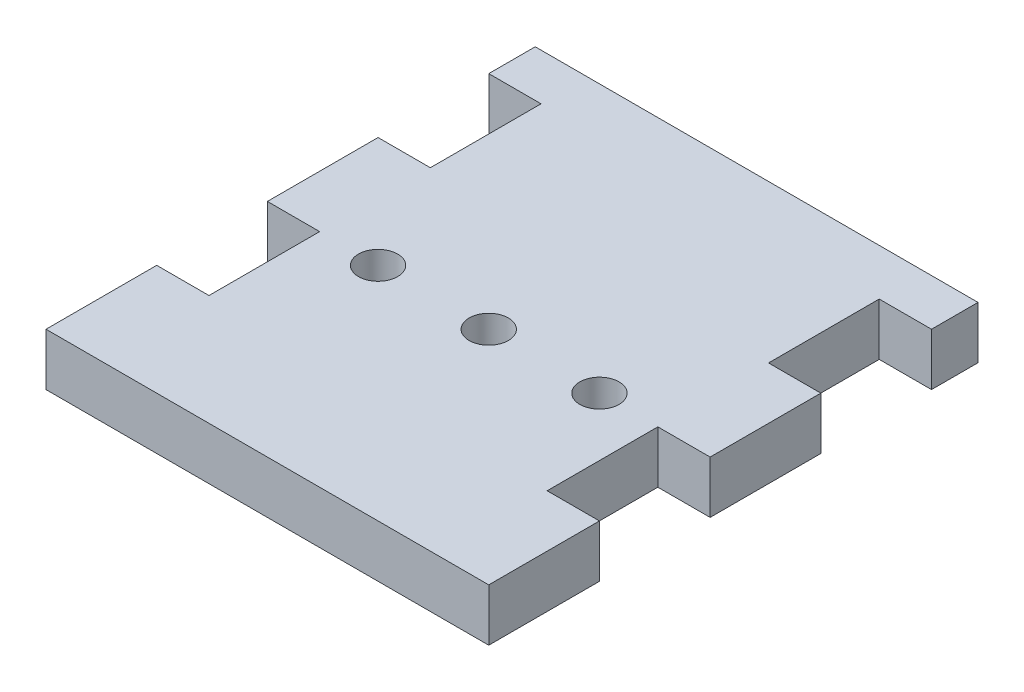
ISO-10303-21;
HEADER;
FILE_DESCRIPTION(('STEP AP214'),'2;1');
FILE_NAME('part.step','',(''),(''),'','','');
FILE_SCHEMA(('AUTOMOTIVE_DESIGN { 1 0 10303 214 1 1 1 1 }'));
ENDSEC;
DATA;
#1=APPLICATION_CONTEXT('core data for automotive mechanical design processes');
#2=APPLICATION_PROTOCOL_DEFINITION('international standard','automotive_design',2000,#1);
#3=PRODUCT_CONTEXT('',#1,'mechanical');
#4=PRODUCT('Part','Part','',(#3));
#5=PRODUCT_RELATED_PRODUCT_CATEGORY('part','',(#4));
#6=PRODUCT_DEFINITION_FORMATION('','',#4);
#7=PRODUCT_DEFINITION_CONTEXT('part definition',#1,'design');
#8=PRODUCT_DEFINITION('design','',#6,#7);
#9=PRODUCT_DEFINITION_SHAPE('','',#8);
#10=(LENGTH_UNIT() NAMED_UNIT(*) SI_UNIT(.MILLI.,.METRE.));
#11=(NAMED_UNIT(*) PLANE_ANGLE_UNIT() SI_UNIT($,.RADIAN.));
#12=(NAMED_UNIT(*) SI_UNIT($,.STERADIAN.) SOLID_ANGLE_UNIT());
#13=UNCERTAINTY_MEASURE_WITH_UNIT(LENGTH_MEASURE(1.E-05),#10,'distance_accuracy_value','');
#14=(GEOMETRIC_REPRESENTATION_CONTEXT(3) GLOBAL_UNCERTAINTY_ASSIGNED_CONTEXT((#13)) GLOBAL_UNIT_ASSIGNED_CONTEXT((#10,
#11,#12)) REPRESENTATION_CONTEXT('',''));
#15=CARTESIAN_POINT('',(0.,0.,0.));
#16=DIRECTION('',(0.,0.,1.));
#17=DIRECTION('',(1.,0.,0.));
#18=AXIS2_PLACEMENT_3D('',#15,#16,#17);
#19=CARTESIAN_POINT('',(25.4,6.,28.067));
#20=DIRECTION('',(-1.,0.,0.));
#21=DIRECTION('',(0.,0.,1.));
#22=AXIS2_PLACEMENT_3D('',#19,#20,#21);
#23=PLANE('',#22);
#24=DIRECTION('',(0.,0.,-1.));
#25=VECTOR('',#24,1.);
#26=CARTESIAN_POINT('',(25.4,0.,28.067));
#27=LINE('',#26,#25);
#28=CARTESIAN_POINT('',(25.4,0.,2.66700000000001));
#29=VERTEX_POINT('',#28);
#30=CARTESIAN_POINT('',(25.4,0.,-10.033));
#31=VERTEX_POINT('',#30);
#32=EDGE_CURVE('E185',#29,#31,#27,.T.);
#33=ORIENTED_EDGE('',*,*,#32,.T.);
#34=DIRECTION('',(0.,1.,0.));
#35=VECTOR('',#34,1.);
#36=CARTESIAN_POINT('',(25.4,0.,-10.033));
#37=LINE('',#36,#35);
#38=CARTESIAN_POINT('',(25.4,6.,-10.033));
#39=VERTEX_POINT('',#38);
#40=EDGE_CURVE('E169',#31,#39,#37,.T.);
#41=ORIENTED_EDGE('',*,*,#40,.T.);
#42=DIRECTION('',(0.,0.,-1.));
#43=VECTOR('',#42,1.);
#44=CARTESIAN_POINT('',(25.4,6.,28.067));
#45=LINE('',#44,#43);
#46=CARTESIAN_POINT('',(25.4,6.,2.66700000000001));
#47=VERTEX_POINT('',#46);
#48=EDGE_CURVE('E310',#47,#39,#45,.T.);
#49=ORIENTED_EDGE('',*,*,#48,.F.);
#50=DIRECTION('',(0.,1.,0.));
#51=VECTOR('',#50,1.);
#52=CARTESIAN_POINT('',(25.4,0.,2.66700000000001));
#53=LINE('',#52,#51);
#54=EDGE_CURVE('E191',#29,#47,#53,.T.);
#55=ORIENTED_EDGE('',*,*,#54,.F.);
#56=EDGE_LOOP('',(#33,#41,#49,#55));
#57=FACE_BOUND('',#56,.T.);
#58=ADVANCED_FACE('F32',(#57),#23,.F.);
#59=CARTESIAN_POINT('',(25.4,0.,28.067));
#60=VERTEX_POINT('',#59);
#61=CARTESIAN_POINT('',(25.4,0.,15.367));
#62=VERTEX_POINT('',#61);
#63=EDGE_CURVE('E192',#60,#62,#27,.T.);
#64=ORIENTED_EDGE('',*,*,#63,.T.);
#65=DIRECTION('',(0.,1.,0.));
#66=VECTOR('',#65,1.);
#67=CARTESIAN_POINT('',(25.4,0.,15.367));
#68=LINE('',#67,#66);
#69=CARTESIAN_POINT('',(25.4,6.,15.367));
#70=VERTEX_POINT('',#69);
#71=EDGE_CURVE('E236',#62,#70,#68,.T.);
#72=ORIENTED_EDGE('',*,*,#71,.T.);
#73=CARTESIAN_POINT('',(25.4,6.,28.067));
#74=VERTEX_POINT('',#73);
#75=EDGE_CURVE('E217',#74,#70,#45,.T.);
#76=ORIENTED_EDGE('',*,*,#75,.F.);
#77=DIRECTION('',(0.,-1.,0.));
#78=VECTOR('',#77,1.);
#79=CARTESIAN_POINT('',(25.4,6.,28.067));
#80=LINE('',#79,#78);
#81=EDGE_CURVE('E40',#74,#60,#80,.T.);
#82=ORIENTED_EDGE('',*,*,#81,.T.);
#83=EDGE_LOOP('',(#64,#72,#76,#82));
#84=FACE_BOUND('',#83,.T.);
#85=ADVANCED_FACE('F214',(#84),#23,.F.);
#86=CARTESIAN_POINT('',(-25.4,6.,28.067));
#87=DIRECTION('',(1.,0.,0.));
#88=DIRECTION('',(0.,0.,-1.));
#89=AXIS2_PLACEMENT_3D('',#86,#87,#88);
#90=PLANE('',#89);
#91=DIRECTION('',(0.,0.,1.));
#92=VECTOR('',#91,1.);
#93=CARTESIAN_POINT('',(-25.4,0.,28.067));
#94=LINE('',#93,#92);
#95=CARTESIAN_POINT('',(-25.4,0.,-28.067));
#96=VERTEX_POINT('',#95);
#97=CARTESIAN_POINT('',(-25.4,0.,-22.733));
#98=VERTEX_POINT('',#97);
#99=EDGE_CURVE('E311',#96,#98,#94,.T.);
#100=ORIENTED_EDGE('',*,*,#99,.T.);
#101=DIRECTION('',(0.,1.,0.));
#102=VECTOR('',#101,1.);
#103=CARTESIAN_POINT('',(-25.4,0.,-22.733));
#104=LINE('',#103,#102);
#105=CARTESIAN_POINT('',(-25.4,6.,-22.733));
#106=VERTEX_POINT('',#105);
#107=EDGE_CURVE('E266',#98,#106,#104,.T.);
#108=ORIENTED_EDGE('',*,*,#107,.T.);
#109=DIRECTION('',(0.,0.,1.));
#110=VECTOR('',#109,1.);
#111=CARTESIAN_POINT('',(-25.4,6.,28.067));
#112=LINE('',#111,#110);
#113=CARTESIAN_POINT('',(-25.4,6.,-28.067));
#114=VERTEX_POINT('',#113);
#115=EDGE_CURVE('E302',#114,#106,#112,.T.);
#116=ORIENTED_EDGE('',*,*,#115,.F.);
#117=DIRECTION('',(0.,-1.,0.));
#118=VECTOR('',#117,1.);
#119=CARTESIAN_POINT('',(-25.4,6.,-28.067));
#120=LINE('',#119,#118);
#121=EDGE_CURVE('E203',#114,#96,#120,.T.);
#122=ORIENTED_EDGE('',*,*,#121,.T.);
#123=EDGE_LOOP('',(#100,#108,#116,#122));
#124=FACE_BOUND('',#123,.T.);
#125=ADVANCED_FACE('F352',(#124),#90,.F.);
#126=CARTESIAN_POINT('',(-25.4,6.,-10.033));
#127=VERTEX_POINT('',#126);
#128=CARTESIAN_POINT('',(-25.4,6.,2.66700000000001));
#129=VERTEX_POINT('',#128);
#130=EDGE_CURVE('E306',#127,#129,#112,.T.);
#131=ORIENTED_EDGE('',*,*,#130,.F.);
#132=DIRECTION('',(0.,1.,0.));
#133=VECTOR('',#132,1.);
#134=CARTESIAN_POINT('',(-25.4,0.,-10.033));
#135=LINE('',#134,#133);
#136=CARTESIAN_POINT('',(-25.4,0.,-10.033));
#137=VERTEX_POINT('',#136);
#138=EDGE_CURVE('E259',#137,#127,#135,.T.);
#139=ORIENTED_EDGE('',*,*,#138,.F.);
#140=CARTESIAN_POINT('',(-25.4,0.,2.66700000000001));
#141=VERTEX_POINT('',#140);
#142=EDGE_CURVE('E313',#137,#141,#94,.T.);
#143=ORIENTED_EDGE('',*,*,#142,.T.);
#144=DIRECTION('',(0.,1.,0.));
#145=VECTOR('',#144,1.);
#146=CARTESIAN_POINT('',(-25.4,0.,2.66700000000001));
#147=LINE('',#146,#145);
#148=EDGE_CURVE('E293',#141,#129,#147,.T.);
#149=ORIENTED_EDGE('',*,*,#148,.T.);
#150=EDGE_LOOP('',(#131,#139,#143,#149));
#151=FACE_BOUND('',#150,.T.);
#152=ADVANCED_FACE('F336',(#151),#90,.F.);
#153=CARTESIAN_POINT('',(-25.4,6.,15.367));
#154=VERTEX_POINT('',#153);
#155=CARTESIAN_POINT('',(-25.4,6.,28.067));
#156=VERTEX_POINT('',#155);
#157=EDGE_CURVE('E202',#154,#156,#112,.T.);
#158=ORIENTED_EDGE('',*,*,#157,.F.);
#159=DIRECTION('',(0.,1.,0.));
#160=VECTOR('',#159,1.);
#161=CARTESIAN_POINT('',(-25.4,0.,15.367));
#162=LINE('',#161,#160);
#163=CARTESIAN_POINT('',(-25.4,0.,15.367));
#164=VERTEX_POINT('',#163);
#165=EDGE_CURVE('E285',#164,#154,#162,.T.);
#166=ORIENTED_EDGE('',*,*,#165,.F.);
#167=CARTESIAN_POINT('',(-25.4,0.,28.067));
#168=VERTEX_POINT('',#167);
#169=EDGE_CURVE('E296',#164,#168,#94,.T.);
#170=ORIENTED_EDGE('',*,*,#169,.T.);
#171=DIRECTION('',(0.,-1.,0.));
#172=VECTOR('',#171,1.);
#173=CARTESIAN_POINT('',(-25.4,6.,28.067));
#174=LINE('',#173,#172);
#175=EDGE_CURVE('E11',#156,#168,#174,.T.);
#176=ORIENTED_EDGE('',*,*,#175,.F.);
#177=EDGE_LOOP('',(#158,#166,#170,#176));
#178=FACE_BOUND('',#177,.T.);
#179=ADVANCED_FACE('F34',(#178),#90,.F.);
#180=CARTESIAN_POINT('',(25.4,6.,28.067));
#181=DIRECTION('',(0.,0.,-1.));
#182=DIRECTION('',(-1.,0.,0.));
#183=AXIS2_PLACEMENT_3D('',#180,#181,#182);
#184=PLANE('',#183);
#185=DIRECTION('',(1.,0.,0.));
#186=VECTOR('',#185,1.);
#187=CARTESIAN_POINT('',(25.4,0.,28.067));
#188=LINE('',#187,#186);
#189=EDGE_CURVE('E197',#168,#60,#188,.T.);
#190=ORIENTED_EDGE('',*,*,#189,.T.);
#191=ORIENTED_EDGE('',*,*,#81,.F.);
#192=DIRECTION('',(1.,0.,0.));
#193=VECTOR('',#192,1.);
#194=CARTESIAN_POINT('',(25.4,6.,28.067));
#195=LINE('',#194,#193);
#196=EDGE_CURVE('E305',#156,#74,#195,.T.);
#197=ORIENTED_EDGE('',*,*,#196,.F.);
#198=ORIENTED_EDGE('',*,*,#175,.T.);
#199=EDGE_LOOP('',(#190,#191,#197,#198));
#200=FACE_BOUND('',#199,.T.);
#201=ADVANCED_FACE('F434',(#200),#184,.F.);
#202=CARTESIAN_POINT('',(25.4,6.,-22.733));
#203=VERTEX_POINT('',#202);
#204=CARTESIAN_POINT('',(25.4,6.,-28.067));
#205=VERTEX_POINT('',#204);
#206=EDGE_CURVE('E308',#203,#205,#45,.T.);
#207=ORIENTED_EDGE('',*,*,#206,.F.);
#208=DIRECTION('',(0.,1.,0.));
#209=VECTOR('',#208,1.);
#210=CARTESIAN_POINT('',(25.4,0.,-22.733));
#211=LINE('',#210,#209);
#212=CARTESIAN_POINT('',(25.4,0.,-22.733));
#213=VERTEX_POINT('',#212);
#214=EDGE_CURVE('E179',#213,#203,#211,.T.);
#215=ORIENTED_EDGE('',*,*,#214,.F.);
#216=CARTESIAN_POINT('',(25.4,0.,-28.067));
#217=VERTEX_POINT('',#216);
#218=EDGE_CURVE('E193',#213,#217,#27,.T.);
#219=ORIENTED_EDGE('',*,*,#218,.T.);
#220=DIRECTION('',(0.,-1.,0.));
#221=VECTOR('',#220,1.);
#222=CARTESIAN_POINT('',(25.4,6.,-28.067));
#223=LINE('',#222,#221);
#224=EDGE_CURVE('E206',#205,#217,#223,.T.);
#225=ORIENTED_EDGE('',*,*,#224,.F.);
#226=EDGE_LOOP('',(#207,#215,#219,#225));
#227=FACE_BOUND('',#226,.T.);
#228=ADVANCED_FACE('F363',(#227),#23,.F.);
#229=CARTESIAN_POINT('',(25.4,6.,-28.067));
#230=DIRECTION('',(0.,0.,1.));
#231=DIRECTION('',(1.,0.,0.));
#232=AXIS2_PLACEMENT_3D('',#229,#230,#231);
#233=PLANE('',#232);
#234=DIRECTION('',(-1.,0.,0.));
#235=VECTOR('',#234,1.);
#236=CARTESIAN_POINT('',(25.4,0.,-28.067));
#237=LINE('',#236,#235);
#238=EDGE_CURVE('E196',#217,#96,#237,.T.);
#239=ORIENTED_EDGE('',*,*,#238,.T.);
#240=ORIENTED_EDGE('',*,*,#121,.F.);
#241=DIRECTION('',(-1.,0.,0.));
#242=VECTOR('',#241,1.);
#243=CARTESIAN_POINT('',(25.4,6.,-28.067));
#244=LINE('',#243,#242);
#245=EDGE_CURVE('E207',#205,#114,#244,.T.);
#246=ORIENTED_EDGE('',*,*,#245,.F.);
#247=ORIENTED_EDGE('',*,*,#224,.T.);
#248=EDGE_LOOP('',(#239,#240,#246,#247));
#249=FACE_BOUND('',#248,.T.);
#250=ADVANCED_FACE('F359',(#249),#233,.F.);
#251=CARTESIAN_POINT('',(0.,6.,0.));
#252=DIRECTION('',(0.,1.,0.));
#253=DIRECTION('',(0.,0.,1.));
#254=AXIS2_PLACEMENT_3D('',#251,#252,#253);
#255=PLANE('',#254);
#256=CARTESIAN_POINT('',(12.7,6.,2.66700000000001));
#257=DIRECTION('',(0.,-1.,0.));
#258=DIRECTION('',(0.,0.,-1.));
#259=AXIS2_PLACEMENT_3D('',#256,#257,#258);
#260=CIRCLE('',#259,2.2479);
#261=CARTESIAN_POINT('',(12.7,6.,0.419100000000013));
#262=VERTEX_POINT('',#261);
#263=EDGE_CURVE('E387',#262,#262,#260,.T.);
#264=ORIENTED_EDGE('',*,*,#263,.T.);
#265=EDGE_LOOP('',(#264));
#266=FACE_BOUND('',#265,.T.);
#267=CARTESIAN_POINT('',(-12.7,6.,2.66700000000001));
#268=DIRECTION('',(0.,-1.,0.));
#269=DIRECTION('',(0.,0.,-1.));
#270=AXIS2_PLACEMENT_3D('',#267,#268,#269);
#271=CIRCLE('',#270,2.2479);
#272=CARTESIAN_POINT('',(-12.7,6.,0.419100000000009));
#273=VERTEX_POINT('',#272);
#274=EDGE_CURVE('E381',#273,#273,#271,.T.);
#275=ORIENTED_EDGE('',*,*,#274,.T.);
#276=EDGE_LOOP('',(#275));
#277=FACE_BOUND('',#276,.T.);
#278=CARTESIAN_POINT('',(0.,6.,2.66700000000001));
#279=DIRECTION('',(0.,-1.,0.));
#280=DIRECTION('',(0.,0.,-1.));
#281=AXIS2_PLACEMENT_3D('',#278,#279,#280);
#282=CIRCLE('',#281,2.2479);
#283=CARTESIAN_POINT('',(0.,6.,0.41910000000001));
#284=VERTEX_POINT('',#283);
#285=EDGE_CURVE('E375',#284,#284,#282,.T.);
#286=ORIENTED_EDGE('',*,*,#285,.T.);
#287=EDGE_LOOP('',(#286));
#288=FACE_BOUND('',#287,.T.);
#289=DIRECTION('',(1.,0.,0.));
#290=VECTOR('',#289,1.);
#291=CARTESIAN_POINT('',(25.4,6.,-10.033));
#292=LINE('',#291,#290);
#293=CARTESIAN_POINT('',(19.4,6.,-10.033));
#294=VERTEX_POINT('',#293);
#295=EDGE_CURVE('E174',#294,#39,#292,.T.);
#296=ORIENTED_EDGE('',*,*,#295,.F.);
#297=DIRECTION('',(0.,0.,1.));
#298=VECTOR('',#297,1.);
#299=CARTESIAN_POINT('',(19.4,6.,-10.033));
#300=LINE('',#299,#298);
#301=CARTESIAN_POINT('',(19.4,6.,-22.733));
#302=VERTEX_POINT('',#301);
#303=EDGE_CURVE('E188',#302,#294,#300,.T.);
#304=ORIENTED_EDGE('',*,*,#303,.F.);
#305=DIRECTION('',(-1.,0.,0.));
#306=VECTOR('',#305,1.);
#307=CARTESIAN_POINT('',(25.4,6.,-22.733));
#308=LINE('',#307,#306);
#309=EDGE_CURVE('E372',#203,#302,#308,.T.);
#310=ORIENTED_EDGE('',*,*,#309,.F.);
#311=ORIENTED_EDGE('',*,*,#206,.T.);
#312=ORIENTED_EDGE('',*,*,#245,.T.);
#313=ORIENTED_EDGE('',*,*,#115,.T.);
#314=DIRECTION('',(-1.,0.,0.));
#315=VECTOR('',#314,1.);
#316=CARTESIAN_POINT('',(-25.4,6.,-22.733));
#317=LINE('',#316,#315);
#318=CARTESIAN_POINT('',(-19.4,6.,-22.733));
#319=VERTEX_POINT('',#318);
#320=EDGE_CURVE('E253',#319,#106,#317,.T.);
#321=ORIENTED_EDGE('',*,*,#320,.F.);
#322=DIRECTION('',(0.,0.,-1.));
#323=VECTOR('',#322,1.);
#324=CARTESIAN_POINT('',(-19.4,6.,-10.033));
#325=LINE('',#324,#323);
#326=CARTESIAN_POINT('',(-19.4,6.,-10.033));
#327=VERTEX_POINT('',#326);
#328=EDGE_CURVE('E262',#327,#319,#325,.T.);
#329=ORIENTED_EDGE('',*,*,#328,.F.);
#330=DIRECTION('',(1.,0.,0.));
#331=VECTOR('',#330,1.);
#332=CARTESIAN_POINT('',(-25.4,6.,-10.033));
#333=LINE('',#332,#331);
#334=EDGE_CURVE('E244',#127,#327,#333,.T.);
#335=ORIENTED_EDGE('',*,*,#334,.F.);
#336=ORIENTED_EDGE('',*,*,#130,.T.);
#337=DIRECTION('',(-1.,0.,0.));
#338=VECTOR('',#337,1.);
#339=CARTESIAN_POINT('',(-25.4,6.,2.66700000000001));
#340=LINE('',#339,#338);
#341=CARTESIAN_POINT('',(-19.4,6.,2.66700000000001));
#342=VERTEX_POINT('',#341);
#343=EDGE_CURVE('E279',#342,#129,#340,.T.);
#344=ORIENTED_EDGE('',*,*,#343,.F.);
#345=DIRECTION('',(0.,0.,-1.));
#346=VECTOR('',#345,1.);
#347=CARTESIAN_POINT('',(-19.4,6.,15.367));
#348=LINE('',#347,#346);
#349=CARTESIAN_POINT('',(-19.4,6.,15.367));
#350=VERTEX_POINT('',#349);
#351=EDGE_CURVE('E288',#350,#342,#348,.T.);
#352=ORIENTED_EDGE('',*,*,#351,.F.);
#353=DIRECTION('',(1.,0.,0.));
#354=VECTOR('',#353,1.);
#355=CARTESIAN_POINT('',(-25.4,6.,15.367));
#356=LINE('',#355,#354);
#357=EDGE_CURVE('E269',#154,#350,#356,.T.);
#358=ORIENTED_EDGE('',*,*,#357,.F.);
#359=ORIENTED_EDGE('',*,*,#157,.T.);
#360=ORIENTED_EDGE('',*,*,#196,.T.);
#361=ORIENTED_EDGE('',*,*,#75,.T.);
#362=DIRECTION('',(1.,0.,0.));
#363=VECTOR('',#362,1.);
#364=CARTESIAN_POINT('',(25.4,6.,15.367));
#365=LINE('',#364,#363);
#366=CARTESIAN_POINT('',(19.4,6.,15.367));
#367=VERTEX_POINT('',#366);
#368=EDGE_CURVE('E237',#367,#70,#365,.T.);
#369=ORIENTED_EDGE('',*,*,#368,.F.);
#370=DIRECTION('',(0.,0.,1.));
#371=VECTOR('',#370,1.);
#372=CARTESIAN_POINT('',(19.4,6.,15.367));
#373=LINE('',#372,#371);
#374=CARTESIAN_POINT('',(19.4,6.,2.66700000000001));
#375=VERTEX_POINT('',#374);
#376=EDGE_CURVE('E227',#375,#367,#373,.T.);
#377=ORIENTED_EDGE('',*,*,#376,.F.);
#378=DIRECTION('',(-1.,0.,0.));
#379=VECTOR('',#378,1.);
#380=CARTESIAN_POINT('',(25.4,6.,2.66700000000001));
#381=LINE('',#380,#379);
#382=EDGE_CURVE('E231',#47,#375,#381,.T.);
#383=ORIENTED_EDGE('',*,*,#382,.F.);
#384=ORIENTED_EDGE('',*,*,#48,.T.);
#385=EDGE_LOOP('',(#296,#304,#310,#311,#312,#313,#321,#329,#335,#336,#344,#352,#358,#359,#360,
#361,#369,#377,#383,#384));
#386=FACE_BOUND('',#385,.T.);
#387=ADVANCED_FACE('F343',(#266,#277,#288,#386),#255,.T.);
#388=CARTESIAN_POINT('',(0.,0.,0.));
#389=DIRECTION('',(0.,1.,0.));
#390=DIRECTION('',(0.,0.,1.));
#391=AXIS2_PLACEMENT_3D('',#388,#389,#390);
#392=PLANE('',#391);
#393=CARTESIAN_POINT('',(12.7,0.,2.66700000000001));
#394=DIRECTION('',(0.,-1.,0.));
#395=DIRECTION('',(0.,0.,-1.));
#396=AXIS2_PLACEMENT_3D('',#393,#394,#395);
#397=CIRCLE('',#396,2.2479);
#398=CARTESIAN_POINT('',(12.7,0.,0.419100000000013));
#399=VERTEX_POINT('',#398);
#400=EDGE_CURVE('E390',#399,#399,#397,.T.);
#401=ORIENTED_EDGE('',*,*,#400,.F.);
#402=EDGE_LOOP('',(#401));
#403=FACE_BOUND('',#402,.T.);
#404=CARTESIAN_POINT('',(-12.7,0.,2.66700000000001));
#405=DIRECTION('',(0.,-1.,0.));
#406=DIRECTION('',(0.,0.,-1.));
#407=AXIS2_PLACEMENT_3D('',#404,#405,#406);
#408=CIRCLE('',#407,2.2479);
#409=CARTESIAN_POINT('',(-12.7,0.,0.419100000000009));
#410=VERTEX_POINT('',#409);
#411=EDGE_CURVE('E384',#410,#410,#408,.T.);
#412=ORIENTED_EDGE('',*,*,#411,.F.);
#413=EDGE_LOOP('',(#412));
#414=FACE_BOUND('',#413,.T.);
#415=CARTESIAN_POINT('',(0.,0.,2.66700000000001));
#416=DIRECTION('',(0.,-1.,0.));
#417=DIRECTION('',(0.,0.,-1.));
#418=AXIS2_PLACEMENT_3D('',#415,#416,#417);
#419=CIRCLE('',#418,2.2479);
#420=CARTESIAN_POINT('',(0.,0.,0.41910000000001));
#421=VERTEX_POINT('',#420);
#422=EDGE_CURVE('E378',#421,#421,#419,.T.);
#423=ORIENTED_EDGE('',*,*,#422,.F.);
#424=EDGE_LOOP('',(#423));
#425=FACE_BOUND('',#424,.T.);
#426=DIRECTION('',(0.,0.,1.));
#427=VECTOR('',#426,1.);
#428=CARTESIAN_POINT('',(19.4,0.,-10.033));
#429=LINE('',#428,#427);
#430=CARTESIAN_POINT('',(19.4,0.,-22.733));
#431=VERTEX_POINT('',#430);
#432=CARTESIAN_POINT('',(19.4,0.,-10.033));
#433=VERTEX_POINT('',#432);
#434=EDGE_CURVE('E47',#431,#433,#429,.T.);
#435=ORIENTED_EDGE('',*,*,#434,.T.);
#436=DIRECTION('',(1.,0.,0.));
#437=VECTOR('',#436,1.);
#438=CARTESIAN_POINT('',(25.4,0.,-10.033));
#439=LINE('',#438,#437);
#440=EDGE_CURVE('E172',#433,#31,#439,.T.);
#441=ORIENTED_EDGE('',*,*,#440,.T.);
#442=ORIENTED_EDGE('',*,*,#32,.F.);
#443=DIRECTION('',(-1.,0.,0.));
#444=VECTOR('',#443,1.);
#445=CARTESIAN_POINT('',(25.4,0.,2.66700000000001));
#446=LINE('',#445,#444);
#447=CARTESIAN_POINT('',(19.4,0.,2.66700000000001));
#448=VERTEX_POINT('',#447);
#449=EDGE_CURVE('E226',#29,#448,#446,.T.);
#450=ORIENTED_EDGE('',*,*,#449,.T.);
#451=DIRECTION('',(0.,0.,1.));
#452=VECTOR('',#451,1.);
#453=CARTESIAN_POINT('',(19.4,0.,15.367));
#454=LINE('',#453,#452);
#455=CARTESIAN_POINT('',(19.4,0.,15.367));
#456=VERTEX_POINT('',#455);
#457=EDGE_CURVE('E55',#448,#456,#454,.T.);
#458=ORIENTED_EDGE('',*,*,#457,.T.);
#459=DIRECTION('',(1.,0.,0.));
#460=VECTOR('',#459,1.);
#461=CARTESIAN_POINT('',(25.4,0.,15.367));
#462=LINE('',#461,#460);
#463=EDGE_CURVE('E224',#456,#62,#462,.T.);
#464=ORIENTED_EDGE('',*,*,#463,.T.);
#465=ORIENTED_EDGE('',*,*,#63,.F.);
#466=ORIENTED_EDGE('',*,*,#189,.F.);
#467=ORIENTED_EDGE('',*,*,#169,.F.);
#468=DIRECTION('',(1.,0.,0.));
#469=VECTOR('',#468,1.);
#470=CARTESIAN_POINT('',(-25.4,0.,15.367));
#471=LINE('',#470,#469);
#472=CARTESIAN_POINT('',(-19.4,0.,15.367));
#473=VERTEX_POINT('',#472);
#474=EDGE_CURVE('E275',#164,#473,#471,.T.);
#475=ORIENTED_EDGE('',*,*,#474,.T.);
#476=DIRECTION('',(0.,0.,-1.));
#477=VECTOR('',#476,1.);
#478=CARTESIAN_POINT('',(-19.4,0.,15.367));
#479=LINE('',#478,#477);
#480=CARTESIAN_POINT('',(-19.4,0.,2.66700000000001));
#481=VERTEX_POINT('',#480);
#482=EDGE_CURVE('E278',#473,#481,#479,.T.);
#483=ORIENTED_EDGE('',*,*,#482,.T.);
#484=DIRECTION('',(-1.,0.,0.));
#485=VECTOR('',#484,1.);
#486=CARTESIAN_POINT('',(-25.4,0.,2.66700000000001));
#487=LINE('',#486,#485);
#488=EDGE_CURVE('E282',#481,#141,#487,.T.);
#489=ORIENTED_EDGE('',*,*,#488,.T.);
#490=ORIENTED_EDGE('',*,*,#142,.F.);
#491=DIRECTION('',(1.,0.,0.));
#492=VECTOR('',#491,1.);
#493=CARTESIAN_POINT('',(-25.4,0.,-10.033));
#494=LINE('',#493,#492);
#495=CARTESIAN_POINT('',(-19.4,0.,-10.033));
#496=VERTEX_POINT('',#495);
#497=EDGE_CURVE('E249',#137,#496,#494,.T.);
#498=ORIENTED_EDGE('',*,*,#497,.T.);
#499=DIRECTION('',(0.,0.,-1.));
#500=VECTOR('',#499,1.);
#501=CARTESIAN_POINT('',(-19.4,0.,-10.033));
#502=LINE('',#501,#500);
#503=CARTESIAN_POINT('',(-19.4,0.,-22.733));
#504=VERTEX_POINT('',#503);
#505=EDGE_CURVE('E252',#496,#504,#502,.T.);
#506=ORIENTED_EDGE('',*,*,#505,.T.);
#507=DIRECTION('',(-1.,0.,0.));
#508=VECTOR('',#507,1.);
#509=CARTESIAN_POINT('',(-25.4,0.,-22.733));
#510=LINE('',#509,#508);
#511=EDGE_CURVE('E256',#504,#98,#510,.T.);
#512=ORIENTED_EDGE('',*,*,#511,.T.);
#513=ORIENTED_EDGE('',*,*,#99,.F.);
#514=ORIENTED_EDGE('',*,*,#238,.F.);
#515=ORIENTED_EDGE('',*,*,#218,.F.);
#516=DIRECTION('',(-1.,0.,0.));
#517=VECTOR('',#516,1.);
#518=CARTESIAN_POINT('',(25.4,0.,-22.733));
#519=LINE('',#518,#517);
#520=EDGE_CURVE('E187',#213,#431,#519,.T.);
#521=ORIENTED_EDGE('',*,*,#520,.T.);
#522=EDGE_LOOP('',(#435,#441,#442,#450,#458,#464,#465,#466,#467,#475,#483,#489,#490,#498,#506,
#512,#513,#514,#515,#521));
#523=FACE_BOUND('',#522,.T.);
#524=ADVANCED_FACE('F183',(#403,#414,#425,#523),#392,.F.);
#525=CARTESIAN_POINT('',(-25.4,0.,2.66700000000001));
#526=DIRECTION('',(0.,0.,-1.));
#527=DIRECTION('',(-1.,0.,0.));
#528=AXIS2_PLACEMENT_3D('',#525,#526,#527);
#529=PLANE('',#528);
#530=ORIENTED_EDGE('',*,*,#343,.T.);
#531=ORIENTED_EDGE('',*,*,#148,.F.);
#532=ORIENTED_EDGE('',*,*,#488,.F.);
#533=DIRECTION('',(0.,1.,0.));
#534=VECTOR('',#533,1.);
#535=CARTESIAN_POINT('',(-19.4,0.,2.66700000000001));
#536=LINE('',#535,#534);
#537=EDGE_CURVE('E297',#481,#342,#536,.T.);
#538=ORIENTED_EDGE('',*,*,#537,.T.);
#539=EDGE_LOOP('',(#530,#531,#532,#538));
#540=FACE_BOUND('',#539,.T.);
#541=ADVANCED_FACE('F331',(#540),#529,.F.);
#542=CARTESIAN_POINT('',(-19.4,0.,15.367));
#543=DIRECTION('',(1.,0.,0.));
#544=DIRECTION('',(0.,0.,-1.));
#545=AXIS2_PLACEMENT_3D('',#542,#543,#544);
#546=PLANE('',#545);
#547=ORIENTED_EDGE('',*,*,#351,.T.);
#548=ORIENTED_EDGE('',*,*,#537,.F.);
#549=ORIENTED_EDGE('',*,*,#482,.F.);
#550=DIRECTION('',(0.,1.,0.));
#551=VECTOR('',#550,1.);
#552=CARTESIAN_POINT('',(-19.4,0.,15.367));
#553=LINE('',#552,#551);
#554=EDGE_CURVE('E299',#473,#350,#553,.T.);
#555=ORIENTED_EDGE('',*,*,#554,.T.);
#556=EDGE_LOOP('',(#547,#548,#549,#555));
#557=FACE_BOUND('',#556,.T.);
#558=ADVANCED_FACE('F326',(#557),#546,.F.);
#559=CARTESIAN_POINT('',(-25.4,0.,15.367));
#560=DIRECTION('',(0.,0.,1.));
#561=DIRECTION('',(1.,0.,0.));
#562=AXIS2_PLACEMENT_3D('',#559,#560,#561);
#563=PLANE('',#562);
#564=ORIENTED_EDGE('',*,*,#357,.T.);
#565=ORIENTED_EDGE('',*,*,#554,.F.);
#566=ORIENTED_EDGE('',*,*,#474,.F.);
#567=ORIENTED_EDGE('',*,*,#165,.T.);
#568=EDGE_LOOP('',(#564,#565,#566,#567));
#569=FACE_BOUND('',#568,.T.);
#570=ADVANCED_FACE('F322',(#569),#563,.F.);
#571=CARTESIAN_POINT('',(-25.4,0.,-22.733));
#572=DIRECTION('',(0.,0.,-1.));
#573=DIRECTION('',(-1.,0.,0.));
#574=AXIS2_PLACEMENT_3D('',#571,#572,#573);
#575=PLANE('',#574);
#576=ORIENTED_EDGE('',*,*,#320,.T.);
#577=ORIENTED_EDGE('',*,*,#107,.F.);
#578=ORIENTED_EDGE('',*,*,#511,.F.);
#579=DIRECTION('',(0.,1.,0.));
#580=VECTOR('',#579,1.);
#581=CARTESIAN_POINT('',(-19.4,0.,-22.733));
#582=LINE('',#581,#580);
#583=EDGE_CURVE('E270',#504,#319,#582,.T.);
#584=ORIENTED_EDGE('',*,*,#583,.T.);
#585=EDGE_LOOP('',(#576,#577,#578,#584));
#586=FACE_BOUND('',#585,.T.);
#587=ADVANCED_FACE('F350',(#586),#575,.F.);
#588=CARTESIAN_POINT('',(-19.4,0.,-10.033));
#589=DIRECTION('',(1.,0.,0.));
#590=DIRECTION('',(0.,0.,-1.));
#591=AXIS2_PLACEMENT_3D('',#588,#589,#590);
#592=PLANE('',#591);
#593=ORIENTED_EDGE('',*,*,#328,.T.);
#594=ORIENTED_EDGE('',*,*,#583,.F.);
#595=ORIENTED_EDGE('',*,*,#505,.F.);
#596=DIRECTION('',(0.,1.,0.));
#597=VECTOR('',#596,1.);
#598=CARTESIAN_POINT('',(-19.4,0.,-10.033));
#599=LINE('',#598,#597);
#600=EDGE_CURVE('E272',#496,#327,#599,.T.);
#601=ORIENTED_EDGE('',*,*,#600,.T.);
#602=EDGE_LOOP('',(#593,#594,#595,#601));
#603=FACE_BOUND('',#602,.T.);
#604=ADVANCED_FACE('F346',(#603),#592,.F.);
#605=CARTESIAN_POINT('',(-25.4,0.,-10.033));
#606=DIRECTION('',(0.,0.,1.));
#607=DIRECTION('',(1.,0.,0.));
#608=AXIS2_PLACEMENT_3D('',#605,#606,#607);
#609=PLANE('',#608);
#610=ORIENTED_EDGE('',*,*,#334,.T.);
#611=ORIENTED_EDGE('',*,*,#600,.F.);
#612=ORIENTED_EDGE('',*,*,#497,.F.);
#613=ORIENTED_EDGE('',*,*,#138,.T.);
#614=EDGE_LOOP('',(#610,#611,#612,#613));
#615=FACE_BOUND('',#614,.T.);
#616=ADVANCED_FACE('F339',(#615),#609,.F.);
#617=CARTESIAN_POINT('',(25.4,0.,15.367));
#618=DIRECTION('',(0.,0.,1.));
#619=DIRECTION('',(1.,0.,0.));
#620=AXIS2_PLACEMENT_3D('',#617,#618,#619);
#621=PLANE('',#620);
#622=ORIENTED_EDGE('',*,*,#368,.T.);
#623=ORIENTED_EDGE('',*,*,#71,.F.);
#624=ORIENTED_EDGE('',*,*,#463,.F.);
#625=DIRECTION('',(0.,1.,0.));
#626=VECTOR('',#625,1.);
#627=CARTESIAN_POINT('',(19.4,0.,15.367));
#628=LINE('',#627,#626);
#629=EDGE_CURVE('E242',#456,#367,#628,.T.);
#630=ORIENTED_EDGE('',*,*,#629,.T.);
#631=EDGE_LOOP('',(#622,#623,#624,#630));
#632=FACE_BOUND('',#631,.T.);
#633=ADVANCED_FACE('F445',(#632),#621,.F.);
#634=CARTESIAN_POINT('',(19.4,0.,15.367));
#635=DIRECTION('',(-1.,0.,0.));
#636=DIRECTION('',(0.,0.,1.));
#637=AXIS2_PLACEMENT_3D('',#634,#635,#636);
#638=PLANE('',#637);
#639=ORIENTED_EDGE('',*,*,#376,.T.);
#640=ORIENTED_EDGE('',*,*,#629,.F.);
#641=ORIENTED_EDGE('',*,*,#457,.F.);
#642=DIRECTION('',(0.,1.,0.));
#643=VECTOR('',#642,1.);
#644=CARTESIAN_POINT('',(19.4,0.,2.66700000000001));
#645=LINE('',#644,#643);
#646=EDGE_CURVE('E245',#448,#375,#645,.T.);
#647=ORIENTED_EDGE('',*,*,#646,.T.);
#648=EDGE_LOOP('',(#639,#640,#641,#647));
#649=FACE_BOUND('',#648,.T.);
#650=ADVANCED_FACE('F446',(#649),#638,.F.);
#651=CARTESIAN_POINT('',(25.4,0.,2.66700000000001));
#652=DIRECTION('',(0.,0.,-1.));
#653=DIRECTION('',(-1.,0.,0.));
#654=AXIS2_PLACEMENT_3D('',#651,#652,#653);
#655=PLANE('',#654);
#656=ORIENTED_EDGE('',*,*,#382,.T.);
#657=ORIENTED_EDGE('',*,*,#646,.F.);
#658=ORIENTED_EDGE('',*,*,#449,.F.);
#659=ORIENTED_EDGE('',*,*,#54,.T.);
#660=EDGE_LOOP('',(#656,#657,#658,#659));
#661=FACE_BOUND('',#660,.T.);
#662=ADVANCED_FACE('F448',(#661),#655,.F.);
#663=CARTESIAN_POINT('',(25.4,0.,-10.033));
#664=DIRECTION('',(0.,0.,1.));
#665=DIRECTION('',(1.,0.,0.));
#666=AXIS2_PLACEMENT_3D('',#663,#664,#665);
#667=PLANE('',#666);
#668=ORIENTED_EDGE('',*,*,#295,.T.);
#669=ORIENTED_EDGE('',*,*,#40,.F.);
#670=ORIENTED_EDGE('',*,*,#440,.F.);
#671=DIRECTION('',(0.,1.,0.));
#672=VECTOR('',#671,1.);
#673=CARTESIAN_POINT('',(19.4,0.,-10.033));
#674=LINE('',#673,#672);
#675=EDGE_CURVE('E239',#433,#294,#674,.T.);
#676=ORIENTED_EDGE('',*,*,#675,.T.);
#677=EDGE_LOOP('',(#668,#669,#670,#676));
#678=FACE_BOUND('',#677,.T.);
#679=ADVANCED_FACE('F171',(#678),#667,.F.);
#680=CARTESIAN_POINT('',(19.4,0.,-10.033));
#681=DIRECTION('',(-1.,0.,0.));
#682=DIRECTION('',(0.,0.,1.));
#683=AXIS2_PLACEMENT_3D('',#680,#681,#682);
#684=PLANE('',#683);
#685=ORIENTED_EDGE('',*,*,#303,.T.);
#686=ORIENTED_EDGE('',*,*,#675,.F.);
#687=ORIENTED_EDGE('',*,*,#434,.F.);
#688=DIRECTION('',(0.,1.,0.));
#689=VECTOR('',#688,1.);
#690=CARTESIAN_POINT('',(19.4,0.,-22.733));
#691=LINE('',#690,#689);
#692=EDGE_CURVE('E366',#431,#302,#691,.T.);
#693=ORIENTED_EDGE('',*,*,#692,.T.);
#694=EDGE_LOOP('',(#685,#686,#687,#693));
#695=FACE_BOUND('',#694,.T.);
#696=ADVANCED_FACE('F423',(#695),#684,.F.);
#697=CARTESIAN_POINT('',(25.4,0.,-22.733));
#698=DIRECTION('',(0.,0.,-1.));
#699=DIRECTION('',(-1.,0.,0.));
#700=AXIS2_PLACEMENT_3D('',#697,#698,#699);
#701=PLANE('',#700);
#702=ORIENTED_EDGE('',*,*,#309,.T.);
#703=ORIENTED_EDGE('',*,*,#692,.F.);
#704=ORIENTED_EDGE('',*,*,#520,.F.);
#705=ORIENTED_EDGE('',*,*,#214,.T.);
#706=EDGE_LOOP('',(#702,#703,#704,#705));
#707=FACE_BOUND('',#706,.T.);
#708=ADVANCED_FACE('F414',(#707),#701,.F.);
#709=CARTESIAN_POINT('',(0.,6.,2.66700000000001));
#710=DIRECTION('',(0.,-1.,0.));
#711=DIRECTION('',(0.,0.,-1.));
#712=AXIS2_PLACEMENT_3D('',#709,#710,#711);
#713=CYLINDRICAL_SURFACE('',#712,2.2479);
#714=ORIENTED_EDGE('',*,*,#285,.F.);
#715=EDGE_LOOP('',(#714));
#716=FACE_BOUND('',#715,.T.);
#717=ORIENTED_EDGE('',*,*,#422,.T.);
#718=EDGE_LOOP('',(#717));
#719=FACE_BOUND('',#718,.T.);
#720=ADVANCED_FACE('F412',(#716,#719),#713,.F.);
#721=CARTESIAN_POINT('',(-12.7,6.,2.66700000000001));
#722=DIRECTION('',(0.,-1.,0.));
#723=DIRECTION('',(0.,0.,-1.));
#724=AXIS2_PLACEMENT_3D('',#721,#722,#723);
#725=CYLINDRICAL_SURFACE('',#724,2.2479);
#726=ORIENTED_EDGE('',*,*,#274,.F.);
#727=EDGE_LOOP('',(#726));
#728=FACE_BOUND('',#727,.T.);
#729=ORIENTED_EDGE('',*,*,#411,.T.);
#730=EDGE_LOOP('',(#729));
#731=FACE_BOUND('',#730,.T.);
#732=ADVANCED_FACE('F401',(#728,#731),#725,.F.);
#733=CARTESIAN_POINT('',(12.7,6.,2.66700000000001));
#734=DIRECTION('',(0.,-1.,0.));
#735=DIRECTION('',(0.,0.,-1.));
#736=AXIS2_PLACEMENT_3D('',#733,#734,#735);
#737=CYLINDRICAL_SURFACE('',#736,2.2479);
#738=ORIENTED_EDGE('',*,*,#263,.F.);
#739=EDGE_LOOP('',(#738));
#740=FACE_BOUND('',#739,.T.);
#741=ORIENTED_EDGE('',*,*,#400,.T.);
#742=EDGE_LOOP('',(#741));
#743=FACE_BOUND('',#742,.T.);
#744=ADVANCED_FACE('F398',(#740,#743),#737,.F.);
#745=CLOSED_SHELL('',(#58,#85,#125,#152,#179,#201,#228,#250,#387,#524,#541,#558,#570,#587,#604,
#616,#633,#650,#662,#679,#696,#708,#720,#732,#744));
#746=MANIFOLD_SOLID_BREP('B2',#745);
#747=ADVANCED_BREP_SHAPE_REPRESENTATION('',(#18,#746),#14);
#748=SHAPE_DEFINITION_REPRESENTATION(#9,#747);
ENDSEC;
END-ISO-10303-21;
